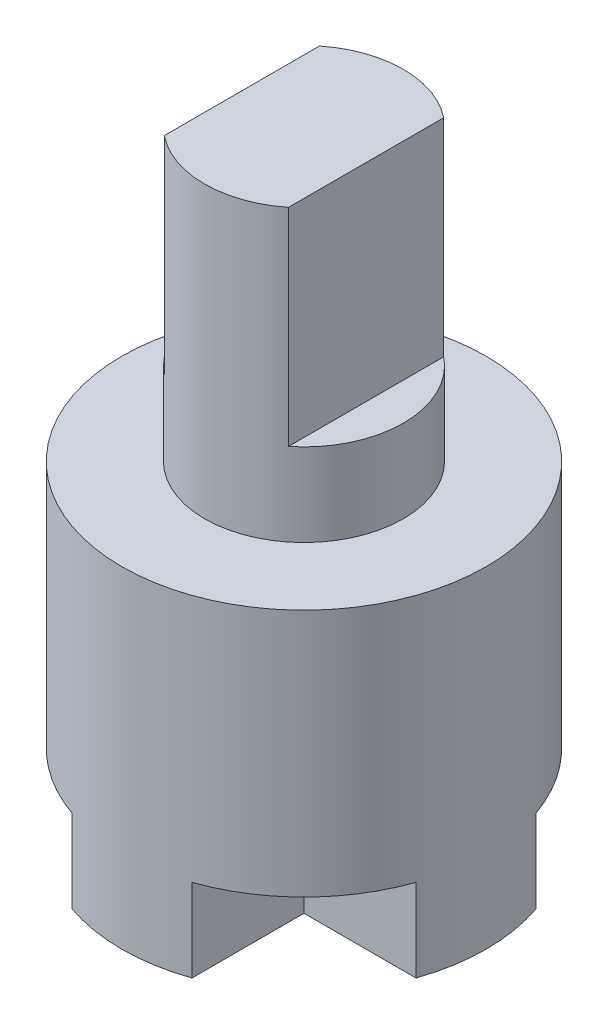
ISO-10303-21;
HEADER;
FILE_DESCRIPTION(('STEP AP214'),'2;1');
FILE_NAME('part.step','',(''),(''),'','','');
FILE_SCHEMA(('AUTOMOTIVE_DESIGN { 1 0 10303 214 1 1 1 1 }'));
ENDSEC;
DATA;
#1=APPLICATION_CONTEXT('core data for automotive mechanical design processes');
#2=APPLICATION_PROTOCOL_DEFINITION('international standard','automotive_design',2000,#1);
#3=PRODUCT_CONTEXT('',#1,'mechanical');
#4=PRODUCT('Part','Part','',(#3));
#5=PRODUCT_RELATED_PRODUCT_CATEGORY('part','',(#4));
#6=PRODUCT_DEFINITION_FORMATION('','',#4);
#7=PRODUCT_DEFINITION_CONTEXT('part definition',#1,'design');
#8=PRODUCT_DEFINITION('design','',#6,#7);
#9=PRODUCT_DEFINITION_SHAPE('','',#8);
#10=(LENGTH_UNIT() NAMED_UNIT(*) SI_UNIT(.MILLI.,.METRE.));
#11=(NAMED_UNIT(*) PLANE_ANGLE_UNIT() SI_UNIT($,.RADIAN.));
#12=(NAMED_UNIT(*) SI_UNIT($,.STERADIAN.) SOLID_ANGLE_UNIT());
#13=UNCERTAINTY_MEASURE_WITH_UNIT(LENGTH_MEASURE(1.E-05),#10,'distance_accuracy_value','');
#14=(GEOMETRIC_REPRESENTATION_CONTEXT(3) GLOBAL_UNCERTAINTY_ASSIGNED_CONTEXT((#13)) GLOBAL_UNIT_ASSIGNED_CONTEXT((#10,
#11,#12)) REPRESENTATION_CONTEXT('',''));
#15=CARTESIAN_POINT('',(0.,0.,0.));
#16=DIRECTION('',(0.,0.,1.));
#17=DIRECTION('',(1.,0.,0.));
#18=AXIS2_PLACEMENT_3D('',#15,#16,#17);
#19=CARTESIAN_POINT('',(0.,0.,0.));
#20=DIRECTION('',(0.,1.,0.));
#21=DIRECTION('',(0.,0.,1.));
#22=AXIS2_PLACEMENT_3D('',#19,#20,#21);
#23=PLANE('',#22);
#24=DIRECTION('',(0.,0.,-1.));
#25=VECTOR('',#24,1.);
#26=CARTESIAN_POINT('',(-1.45,0.,0.));
#27=LINE('',#26,#25);
#28=CARTESIAN_POINT('',(-1.45,0.,-1.45));
#29=VERTEX_POINT('',#28);
#30=CARTESIAN_POINT('',(-1.45,0.,-4.15421472723787));
#31=VERTEX_POINT('',#30);
#32=EDGE_CURVE('E56',#29,#31,#27,.T.);
#33=ORIENTED_EDGE('',*,*,#32,.F.);
#34=DIRECTION('',(1.,0.,0.));
#35=VECTOR('',#34,1.);
#36=CARTESIAN_POINT('',(0.,0.,-1.45));
#37=LINE('',#36,#35);
#38=CARTESIAN_POINT('',(-4.15421472723787,0.,-1.45));
#39=VERTEX_POINT('',#38);
#40=EDGE_CURVE('E180',#39,#29,#37,.T.);
#41=ORIENTED_EDGE('',*,*,#40,.F.);
#42=CARTESIAN_POINT('',(0.,0.,0.));
#43=DIRECTION('',(0.,1.,0.));
#44=DIRECTION('',(0.,0.,1.));
#45=AXIS2_PLACEMENT_3D('',#42,#43,#44);
#46=CIRCLE('',#45,4.4);
#47=EDGE_CURVE('E281',#31,#39,#46,.T.);
#48=ORIENTED_EDGE('',*,*,#47,.F.);
#49=EDGE_LOOP('',(#33,#41,#48));
#50=FACE_BOUND('',#49,.T.);
#51=ADVANCED_FACE('F39',(#50),#23,.F.);
#52=CARTESIAN_POINT('',(-4.15421472723787,0.,1.45));
#53=VERTEX_POINT('',#52);
#54=CARTESIAN_POINT('',(-1.45,0.,4.15421472723787));
#55=VERTEX_POINT('',#54);
#56=EDGE_CURVE('E272',#53,#55,#46,.T.);
#57=ORIENTED_EDGE('',*,*,#56,.F.);
#58=DIRECTION('',(1.,0.,0.));
#59=VECTOR('',#58,1.);
#60=CARTESIAN_POINT('',(0.,0.,1.45));
#61=LINE('',#60,#59);
#62=CARTESIAN_POINT('',(-1.45,0.,1.45));
#63=VERTEX_POINT('',#62);
#64=EDGE_CURVE('E64',#53,#63,#61,.T.);
#65=ORIENTED_EDGE('',*,*,#64,.T.);
#66=DIRECTION('',(0.,0.,-1.));
#67=VECTOR('',#66,1.);
#68=CARTESIAN_POINT('',(-1.45,0.,0.));
#69=LINE('',#68,#67);
#70=EDGE_CURVE('E212',#55,#63,#69,.T.);
#71=ORIENTED_EDGE('',*,*,#70,.F.);
#72=EDGE_LOOP('',(#57,#65,#71));
#73=FACE_BOUND('',#72,.T.);
#74=ADVANCED_FACE('F300',(#73),#23,.F.);
#75=CARTESIAN_POINT('',(1.45,0.,4.15421472723787));
#76=VERTEX_POINT('',#75);
#77=CARTESIAN_POINT('',(4.15421472723787,0.,1.45));
#78=VERTEX_POINT('',#77);
#79=EDGE_CURVE('E43',#76,#78,#46,.T.);
#80=ORIENTED_EDGE('',*,*,#79,.F.);
#81=DIRECTION('',(0.,0.,-1.));
#82=VECTOR('',#81,1.);
#83=CARTESIAN_POINT('',(1.45,0.,0.));
#84=LINE('',#83,#82);
#85=CARTESIAN_POINT('',(1.45,0.,1.45));
#86=VERTEX_POINT('',#85);
#87=EDGE_CURVE('E210',#76,#86,#84,.T.);
#88=ORIENTED_EDGE('',*,*,#87,.T.);
#89=DIRECTION('',(1.,0.,0.));
#90=VECTOR('',#89,1.);
#91=CARTESIAN_POINT('',(0.,0.,1.45));
#92=LINE('',#91,#90);
#93=EDGE_CURVE('E208',#86,#78,#92,.T.);
#94=ORIENTED_EDGE('',*,*,#93,.T.);
#95=EDGE_LOOP('',(#80,#88,#94));
#96=FACE_BOUND('',#95,.T.);
#97=ADVANCED_FACE('F302',(#96),#23,.F.);
#98=CARTESIAN_POINT('',(0.,8.,0.));
#99=DIRECTION('',(0.,1.,0.));
#100=DIRECTION('',(0.,0.,1.));
#101=AXIS2_PLACEMENT_3D('',#98,#99,#100);
#102=PLANE('',#101);
#103=CARTESIAN_POINT('',(0.,8.,0.));
#104=DIRECTION('',(0.,1.,0.));
#105=DIRECTION('',(0.,0.,1.));
#106=AXIS2_PLACEMENT_3D('',#103,#104,#105);
#107=CIRCLE('',#106,2.4);
#108=CARTESIAN_POINT('',(-1.5,8.,-1.87349939951952));
#109=VERTEX_POINT('',#108);
#110=CARTESIAN_POINT('',(-1.5,8.,1.87349939951952));
#111=VERTEX_POINT('',#110);
#112=EDGE_CURVE('E270',#109,#111,#107,.T.);
#113=ORIENTED_EDGE('',*,*,#112,.T.);
#114=DIRECTION('',(0.,0.,-1.));
#115=VECTOR('',#114,1.);
#116=CARTESIAN_POINT('',(-1.5,8.,0.));
#117=LINE('',#116,#115);
#118=EDGE_CURVE('E249',#111,#109,#117,.T.);
#119=ORIENTED_EDGE('',*,*,#118,.T.);
#120=EDGE_LOOP('',(#113,#119));
#121=FACE_BOUND('',#120,.T.);
#122=ADVANCED_FACE('F307',(#121),#102,.T.);
#123=CARTESIAN_POINT('',(0.,6.,0.));
#124=DIRECTION('',(0.,-1.,0.));
#125=DIRECTION('',(0.,0.,-1.));
#126=AXIS2_PLACEMENT_3D('',#123,#124,#125);
#127=CYLINDRICAL_SURFACE('',#126,4.4);
#128=CARTESIAN_POINT('',(0.,6.,0.));
#129=DIRECTION('',(0.,1.,0.));
#130=DIRECTION('',(0.,0.,1.));
#131=AXIS2_PLACEMENT_3D('',#128,#129,#130);
#132=CIRCLE('',#131,4.4);
#133=CARTESIAN_POINT('',(0.,6.,4.4));
#134=VERTEX_POINT('',#133);
#135=EDGE_CURVE('E48',#134,#134,#132,.T.);
#136=ORIENTED_EDGE('',*,*,#135,.F.);
#137=EDGE_LOOP('',(#136));
#138=FACE_BOUND('',#137,.T.);
#139=ORIENTED_EDGE('',*,*,#79,.T.);
#140=DIRECTION('',(0.,1.,0.));
#141=VECTOR('',#140,1.);
#142=CARTESIAN_POINT('',(4.15421472723787,-2.,1.45));
#143=LINE('',#142,#141);
#144=CARTESIAN_POINT('',(4.15421472723787,-2.,1.45));
#145=VERTEX_POINT('',#144);
#146=EDGE_CURVE('E241',#145,#78,#143,.T.);
#147=ORIENTED_EDGE('',*,*,#146,.F.);
#148=CARTESIAN_POINT('',(0.,-2.,0.));
#149=DIRECTION('',(0.,-1.,0.));
#150=DIRECTION('',(0.,0.,-1.));
#151=AXIS2_PLACEMENT_3D('',#148,#149,#150);
#152=CIRCLE('',#151,4.4);
#153=CARTESIAN_POINT('',(4.15421472723787,-2.,-1.45));
#154=VERTEX_POINT('',#153);
#155=EDGE_CURVE('E173',#154,#145,#152,.T.);
#156=ORIENTED_EDGE('',*,*,#155,.F.);
#157=DIRECTION('',(0.,1.,0.));
#158=VECTOR('',#157,1.);
#159=CARTESIAN_POINT('',(4.15421472723787,-2.,-1.45));
#160=LINE('',#159,#158);
#161=CARTESIAN_POINT('',(4.15421472723787,0.,-1.45));
#162=VERTEX_POINT('',#161);
#163=EDGE_CURVE('E165',#154,#162,#160,.T.);
#164=ORIENTED_EDGE('',*,*,#163,.T.);
#165=CARTESIAN_POINT('',(1.45,0.,-4.15421472723787));
#166=VERTEX_POINT('',#165);
#167=EDGE_CURVE('E277',#162,#166,#46,.T.);
#168=ORIENTED_EDGE('',*,*,#167,.T.);
#169=DIRECTION('',(0.,1.,0.));
#170=VECTOR('',#169,1.);
#171=CARTESIAN_POINT('',(1.45,-2.,-4.15421472723787));
#172=LINE('',#171,#170);
#173=CARTESIAN_POINT('',(1.45,-2.,-4.15421472723787));
#174=VERTEX_POINT('',#173);
#175=EDGE_CURVE('E204',#174,#166,#172,.T.);
#176=ORIENTED_EDGE('',*,*,#175,.F.);
#177=CARTESIAN_POINT('',(0.,-2.,0.));
#178=DIRECTION('',(0.,-1.,0.));
#179=DIRECTION('',(0.,0.,-1.));
#180=AXIS2_PLACEMENT_3D('',#177,#178,#179);
#181=CIRCLE('',#180,4.4);
#182=CARTESIAN_POINT('',(-1.45,-2.,-4.15421472723787));
#183=VERTEX_POINT('',#182);
#184=EDGE_CURVE('E177',#183,#174,#181,.T.);
#185=ORIENTED_EDGE('',*,*,#184,.F.);
#186=DIRECTION('',(0.,1.,0.));
#187=VECTOR('',#186,1.);
#188=CARTESIAN_POINT('',(-1.45,-2.,-4.15421472723787));
#189=LINE('',#188,#187);
#190=EDGE_CURVE('E218',#183,#31,#189,.T.);
#191=ORIENTED_EDGE('',*,*,#190,.T.);
#192=ORIENTED_EDGE('',*,*,#47,.T.);
#193=DIRECTION('',(0.,1.,0.));
#194=VECTOR('',#193,1.);
#195=CARTESIAN_POINT('',(-4.15421472723787,-2.,-1.45));
#196=LINE('',#195,#194);
#197=CARTESIAN_POINT('',(-4.15421472723787,-2.,-1.45));
#198=VERTEX_POINT('',#197);
#199=EDGE_CURVE('E224',#198,#39,#196,.T.);
#200=ORIENTED_EDGE('',*,*,#199,.F.);
#201=CARTESIAN_POINT('',(0.,-2.,0.));
#202=DIRECTION('',(0.,-1.,0.));
#203=DIRECTION('',(0.,0.,-1.));
#204=AXIS2_PLACEMENT_3D('',#201,#202,#203);
#205=CIRCLE('',#204,4.4);
#206=CARTESIAN_POINT('',(-4.15421472723787,-2.,1.45));
#207=VERTEX_POINT('',#206);
#208=EDGE_CURVE('E197',#207,#198,#205,.T.);
#209=ORIENTED_EDGE('',*,*,#208,.F.);
#210=DIRECTION('',(0.,1.,0.));
#211=VECTOR('',#210,1.);
#212=CARTESIAN_POINT('',(-4.15421472723787,-2.,1.45));
#213=LINE('',#212,#211);
#214=EDGE_CURVE('E227',#207,#53,#213,.T.);
#215=ORIENTED_EDGE('',*,*,#214,.T.);
#216=ORIENTED_EDGE('',*,*,#56,.T.);
#217=DIRECTION('',(0.,1.,0.));
#218=VECTOR('',#217,1.);
#219=CARTESIAN_POINT('',(-1.45,-2.,4.15421472723787));
#220=LINE('',#219,#218);
#221=CARTESIAN_POINT('',(-1.45,-2.,4.15421472723787));
#222=VERTEX_POINT('',#221);
#223=EDGE_CURVE('E232',#222,#55,#220,.T.);
#224=ORIENTED_EDGE('',*,*,#223,.F.);
#225=CARTESIAN_POINT('',(0.,-2.,0.));
#226=DIRECTION('',(0.,-1.,0.));
#227=DIRECTION('',(0.,0.,-1.));
#228=AXIS2_PLACEMENT_3D('',#225,#226,#227);
#229=CIRCLE('',#228,4.4);
#230=CARTESIAN_POINT('',(1.45,-2.,4.15421472723787));
#231=VERTEX_POINT('',#230);
#232=EDGE_CURVE('E190',#231,#222,#229,.T.);
#233=ORIENTED_EDGE('',*,*,#232,.F.);
#234=DIRECTION('',(0.,1.,0.));
#235=VECTOR('',#234,1.);
#236=CARTESIAN_POINT('',(1.45,-2.,4.15421472723787));
#237=LINE('',#236,#235);
#238=EDGE_CURVE('E235',#231,#76,#237,.T.);
#239=ORIENTED_EDGE('',*,*,#238,.T.);
#240=EDGE_LOOP('',(#139,#147,#156,#164,#168,#176,#185,#191,#192,#200,#209,#215,#216,#224,#233,#239));
#241=FACE_BOUND('',#240,.T.);
#242=ADVANCED_FACE('F41',(#138,#241),#127,.T.);
#243=CARTESIAN_POINT('',(0.,6.,0.));
#244=DIRECTION('',(0.,1.,0.));
#245=DIRECTION('',(0.,0.,1.));
#246=AXIS2_PLACEMENT_3D('',#243,#244,#245);
#247=PLANE('',#246);
#248=CARTESIAN_POINT('',(0.,6.,0.));
#249=DIRECTION('',(0.,1.,0.));
#250=DIRECTION('',(0.,0.,1.));
#251=AXIS2_PLACEMENT_3D('',#248,#249,#250);
#252=CIRCLE('',#251,2.4);
#253=CARTESIAN_POINT('',(0.,6.,2.4));
#254=VERTEX_POINT('',#253);
#255=EDGE_CURVE('E11',#254,#254,#252,.T.);
#256=ORIENTED_EDGE('',*,*,#255,.F.);
#257=EDGE_LOOP('',(#256));
#258=FACE_BOUND('',#257,.T.);
#259=ORIENTED_EDGE('',*,*,#135,.T.);
#260=EDGE_LOOP('',(#259));
#261=FACE_BOUND('',#260,.T.);
#262=ADVANCED_FACE('F313',(#258,#261),#247,.T.);
#263=DIRECTION('',(1.,0.,0.));
#264=VECTOR('',#263,1.);
#265=CARTESIAN_POINT('',(0.,0.,-1.45));
#266=LINE('',#265,#264);
#267=CARTESIAN_POINT('',(1.45,0.,-1.45));
#268=VERTEX_POINT('',#267);
#269=EDGE_CURVE('E206',#268,#162,#266,.T.);
#270=ORIENTED_EDGE('',*,*,#269,.F.);
#271=DIRECTION('',(0.,0.,-1.));
#272=VECTOR('',#271,1.);
#273=CARTESIAN_POINT('',(1.45,0.,0.));
#274=LINE('',#273,#272);
#275=EDGE_CURVE('E161',#268,#166,#274,.T.);
#276=ORIENTED_EDGE('',*,*,#275,.T.);
#277=ORIENTED_EDGE('',*,*,#167,.F.);
#278=EDGE_LOOP('',(#270,#276,#277));
#279=FACE_BOUND('',#278,.T.);
#280=ADVANCED_FACE('F309',(#279),#23,.F.);
#281=CARTESIAN_POINT('',(0.,8.,0.));
#282=DIRECTION('',(0.,-1.,0.));
#283=DIRECTION('',(0.,0.,-1.));
#284=AXIS2_PLACEMENT_3D('',#281,#282,#283);
#285=CYLINDRICAL_SURFACE('',#284,2.4);
#286=CARTESIAN_POINT('',(1.5,8.,1.87349939951952));
#287=VERTEX_POINT('',#286);
#288=CARTESIAN_POINT('',(1.5,8.,-1.87349939951952));
#289=VERTEX_POINT('',#288);
#290=EDGE_CURVE('E271',#287,#289,#107,.T.);
#291=ORIENTED_EDGE('',*,*,#290,.F.);
#292=DIRECTION('',(0.,-1.,0.));
#293=VECTOR('',#292,1.);
#294=CARTESIAN_POINT('',(1.5,13.,1.87349939951952));
#295=LINE('',#294,#293);
#296=CARTESIAN_POINT('',(1.5,13.,1.87349939951952));
#297=VERTEX_POINT('',#296);
#298=EDGE_CURVE('E267',#297,#287,#295,.T.);
#299=ORIENTED_EDGE('',*,*,#298,.F.);
#300=CARTESIAN_POINT('',(0.,13.,0.));
#301=DIRECTION('',(0.,1.,0.));
#302=DIRECTION('',(0.,0.,1.));
#303=AXIS2_PLACEMENT_3D('',#300,#301,#302);
#304=CIRCLE('',#303,2.4);
#305=CARTESIAN_POINT('',(-1.5,13.,1.87349939951952));
#306=VERTEX_POINT('',#305);
#307=EDGE_CURVE('E245',#306,#297,#304,.T.);
#308=ORIENTED_EDGE('',*,*,#307,.F.);
#309=DIRECTION('',(0.,-1.,0.));
#310=VECTOR('',#309,1.);
#311=CARTESIAN_POINT('',(-1.5,13.,1.87349939951952));
#312=LINE('',#311,#310);
#313=EDGE_CURVE('E255',#306,#111,#312,.T.);
#314=ORIENTED_EDGE('',*,*,#313,.T.);
#315=ORIENTED_EDGE('',*,*,#112,.F.);
#316=DIRECTION('',(0.,-1.,0.));
#317=VECTOR('',#316,1.);
#318=CARTESIAN_POINT('',(-1.5,13.,-1.87349939951952));
#319=LINE('',#318,#317);
#320=CARTESIAN_POINT('',(-1.5,13.,-1.87349939951952));
#321=VERTEX_POINT('',#320);
#322=EDGE_CURVE('E261',#321,#109,#319,.T.);
#323=ORIENTED_EDGE('',*,*,#322,.F.);
#324=CARTESIAN_POINT('',(1.5,13.,-1.87349939951952));
#325=VERTEX_POINT('',#324);
#326=EDGE_CURVE('E250',#325,#321,#304,.T.);
#327=ORIENTED_EDGE('',*,*,#326,.F.);
#328=DIRECTION('',(0.,-1.,0.));
#329=VECTOR('',#328,1.);
#330=CARTESIAN_POINT('',(1.5,13.,-1.87349939951952));
#331=LINE('',#330,#329);
#332=EDGE_CURVE('E264',#325,#289,#331,.T.);
#333=ORIENTED_EDGE('',*,*,#332,.T.);
#334=EDGE_LOOP('',(#291,#299,#308,#314,#315,#323,#327,#333));
#335=FACE_BOUND('',#334,.T.);
#336=ORIENTED_EDGE('',*,*,#255,.T.);
#337=EDGE_LOOP('',(#336));
#338=FACE_BOUND('',#337,.T.);
#339=ADVANCED_FACE('F312',(#335,#338),#285,.T.);
#340=DIRECTION('',(0.,0.,-1.));
#341=VECTOR('',#340,1.);
#342=CARTESIAN_POINT('',(1.5,8.,0.));
#343=LINE('',#342,#341);
#344=EDGE_CURVE('E164',#287,#289,#343,.T.);
#345=ORIENTED_EDGE('',*,*,#344,.F.);
#346=ORIENTED_EDGE('',*,*,#290,.T.);
#347=EDGE_LOOP('',(#345,#346));
#348=FACE_BOUND('',#347,.T.);
#349=ADVANCED_FACE('F320',(#348),#102,.T.);
#350=CARTESIAN_POINT('',(1.5,13.,0.));
#351=DIRECTION('',(-1.,0.,0.));
#352=DIRECTION('',(0.,0.,1.));
#353=AXIS2_PLACEMENT_3D('',#350,#351,#352);
#354=PLANE('',#353);
#355=ORIENTED_EDGE('',*,*,#344,.T.);
#356=ORIENTED_EDGE('',*,*,#332,.F.);
#357=DIRECTION('',(0.,0.,-1.));
#358=VECTOR('',#357,1.);
#359=CARTESIAN_POINT('',(1.5,13.,0.));
#360=LINE('',#359,#358);
#361=EDGE_CURVE('E248',#297,#325,#360,.T.);
#362=ORIENTED_EDGE('',*,*,#361,.F.);
#363=ORIENTED_EDGE('',*,*,#298,.T.);
#364=EDGE_LOOP('',(#355,#356,#362,#363));
#365=FACE_BOUND('',#364,.T.);
#366=ADVANCED_FACE('F324',(#365),#354,.F.);
#367=CARTESIAN_POINT('',(-1.5,13.,0.));
#368=DIRECTION('',(-1.,0.,0.));
#369=DIRECTION('',(0.,0.,1.));
#370=AXIS2_PLACEMENT_3D('',#367,#368,#369);
#371=PLANE('',#370);
#372=ORIENTED_EDGE('',*,*,#118,.F.);
#373=ORIENTED_EDGE('',*,*,#313,.F.);
#374=DIRECTION('',(0.,0.,-1.));
#375=VECTOR('',#374,1.);
#376=CARTESIAN_POINT('',(-1.5,13.,0.));
#377=LINE('',#376,#375);
#378=EDGE_CURVE('E252',#306,#321,#377,.T.);
#379=ORIENTED_EDGE('',*,*,#378,.T.);
#380=ORIENTED_EDGE('',*,*,#322,.T.);
#381=EDGE_LOOP('',(#372,#373,#379,#380));
#382=FACE_BOUND('',#381,.T.);
#383=ADVANCED_FACE('F328',(#382),#371,.T.);
#384=CARTESIAN_POINT('',(0.,13.,0.));
#385=DIRECTION('',(0.,1.,0.));
#386=DIRECTION('',(0.,0.,1.));
#387=AXIS2_PLACEMENT_3D('',#384,#385,#386);
#388=PLANE('',#387);
#389=ORIENTED_EDGE('',*,*,#307,.T.);
#390=ORIENTED_EDGE('',*,*,#361,.T.);
#391=ORIENTED_EDGE('',*,*,#326,.T.);
#392=ORIENTED_EDGE('',*,*,#378,.F.);
#393=EDGE_LOOP('',(#389,#390,#391,#392));
#394=FACE_BOUND('',#393,.T.);
#395=ADVANCED_FACE('F332',(#394),#388,.T.);
#396=CARTESIAN_POINT('',(1.45,-2.,0.));
#397=DIRECTION('',(1.,0.,0.));
#398=DIRECTION('',(0.,0.,-1.));
#399=AXIS2_PLACEMENT_3D('',#396,#397,#398);
#400=PLANE('',#399);
#401=ORIENTED_EDGE('',*,*,#275,.F.);
#402=DIRECTION('',(0.,1.,0.));
#403=VECTOR('',#402,1.);
#404=CARTESIAN_POINT('',(1.45,-2.,-1.45));
#405=LINE('',#404,#403);
#406=CARTESIAN_POINT('',(1.45,-2.,-1.45));
#407=VERTEX_POINT('',#406);
#408=EDGE_CURVE('E155',#407,#268,#405,.T.);
#409=ORIENTED_EDGE('',*,*,#408,.F.);
#410=DIRECTION('',(0.,0.,-1.));
#411=VECTOR('',#410,1.);
#412=CARTESIAN_POINT('',(1.45,-2.,0.));
#413=LINE('',#412,#411);
#414=EDGE_CURVE('E160',#407,#174,#413,.T.);
#415=ORIENTED_EDGE('',*,*,#414,.T.);
#416=ORIENTED_EDGE('',*,*,#175,.T.);
#417=EDGE_LOOP('',(#401,#409,#415,#416));
#418=FACE_BOUND('',#417,.T.);
#419=ADVANCED_FACE('F157',(#418),#400,.T.);
#420=CARTESIAN_POINT('',(0.,-2.,-1.45));
#421=DIRECTION('',(0.,0.,1.));
#422=DIRECTION('',(1.,0.,0.));
#423=AXIS2_PLACEMENT_3D('',#420,#421,#422);
#424=PLANE('',#423);
#425=ORIENTED_EDGE('',*,*,#269,.T.);
#426=ORIENTED_EDGE('',*,*,#163,.F.);
#427=DIRECTION('',(1.,0.,0.));
#428=VECTOR('',#427,1.);
#429=CARTESIAN_POINT('',(0.,-2.,-1.45));
#430=LINE('',#429,#428);
#431=EDGE_CURVE('E168',#407,#154,#430,.T.);
#432=ORIENTED_EDGE('',*,*,#431,.F.);
#433=ORIENTED_EDGE('',*,*,#408,.T.);
#434=EDGE_LOOP('',(#425,#426,#432,#433));
#435=FACE_BOUND('',#434,.T.);
#436=ADVANCED_FACE('F169',(#435),#424,.F.);
#437=CARTESIAN_POINT('',(0.,-2.,1.45));
#438=DIRECTION('',(0.,0.,1.));
#439=DIRECTION('',(1.,0.,0.));
#440=AXIS2_PLACEMENT_3D('',#437,#438,#439);
#441=PLANE('',#440);
#442=ORIENTED_EDGE('',*,*,#93,.F.);
#443=DIRECTION('',(0.,1.,0.));
#444=VECTOR('',#443,1.);
#445=CARTESIAN_POINT('',(1.45,-2.,1.45));
#446=LINE('',#445,#444);
#447=CARTESIAN_POINT('',(1.45,-2.,1.45));
#448=VERTEX_POINT('',#447);
#449=EDGE_CURVE('E238',#448,#86,#446,.T.);
#450=ORIENTED_EDGE('',*,*,#449,.F.);
#451=DIRECTION('',(1.,0.,0.));
#452=VECTOR('',#451,1.);
#453=CARTESIAN_POINT('',(0.,-2.,1.45));
#454=LINE('',#453,#452);
#455=EDGE_CURVE('E184',#448,#145,#454,.T.);
#456=ORIENTED_EDGE('',*,*,#455,.T.);
#457=ORIENTED_EDGE('',*,*,#146,.T.);
#458=EDGE_LOOP('',(#442,#450,#456,#457));
#459=FACE_BOUND('',#458,.T.);
#460=ADVANCED_FACE('F341',(#459),#441,.T.);
#461=CARTESIAN_POINT('',(1.45,-2.,0.));
#462=DIRECTION('',(1.,0.,0.));
#463=DIRECTION('',(0.,0.,-1.));
#464=AXIS2_PLACEMENT_3D('',#461,#462,#463);
#465=PLANE('',#464);
#466=ORIENTED_EDGE('',*,*,#87,.F.);
#467=ORIENTED_EDGE('',*,*,#238,.F.);
#468=DIRECTION('',(0.,0.,-1.));
#469=VECTOR('',#468,1.);
#470=CARTESIAN_POINT('',(1.45,-2.,0.));
#471=LINE('',#470,#469);
#472=EDGE_CURVE('E187',#231,#448,#471,.T.);
#473=ORIENTED_EDGE('',*,*,#472,.T.);
#474=ORIENTED_EDGE('',*,*,#449,.T.);
#475=EDGE_LOOP('',(#466,#467,#473,#474));
#476=FACE_BOUND('',#475,.T.);
#477=ADVANCED_FACE('F344',(#476),#465,.T.);
#478=CARTESIAN_POINT('',(-1.45,-2.,0.));
#479=DIRECTION('',(1.,0.,0.));
#480=DIRECTION('',(0.,0.,-1.));
#481=AXIS2_PLACEMENT_3D('',#478,#479,#480);
#482=PLANE('',#481);
#483=ORIENTED_EDGE('',*,*,#70,.T.);
#484=DIRECTION('',(0.,1.,0.));
#485=VECTOR('',#484,1.);
#486=CARTESIAN_POINT('',(-1.45,-2.,1.45));
#487=LINE('',#486,#485);
#488=CARTESIAN_POINT('',(-1.45,-2.,1.45));
#489=VERTEX_POINT('',#488);
#490=EDGE_CURVE('E230',#489,#63,#487,.T.);
#491=ORIENTED_EDGE('',*,*,#490,.F.);
#492=DIRECTION('',(0.,0.,-1.));
#493=VECTOR('',#492,1.);
#494=CARTESIAN_POINT('',(-1.45,-2.,0.));
#495=LINE('',#494,#493);
#496=EDGE_CURVE('E192',#222,#489,#495,.T.);
#497=ORIENTED_EDGE('',*,*,#496,.F.);
#498=ORIENTED_EDGE('',*,*,#223,.T.);
#499=EDGE_LOOP('',(#483,#491,#497,#498));
#500=FACE_BOUND('',#499,.T.);
#501=ADVANCED_FACE('F299',(#500),#482,.F.);
#502=CARTESIAN_POINT('',(0.,-2.,1.45));
#503=DIRECTION('',(0.,0.,1.));
#504=DIRECTION('',(1.,0.,0.));
#505=AXIS2_PLACEMENT_3D('',#502,#503,#504);
#506=PLANE('',#505);
#507=ORIENTED_EDGE('',*,*,#64,.F.);
#508=ORIENTED_EDGE('',*,*,#214,.F.);
#509=DIRECTION('',(1.,0.,0.));
#510=VECTOR('',#509,1.);
#511=CARTESIAN_POINT('',(0.,-2.,1.45));
#512=LINE('',#511,#510);
#513=EDGE_CURVE('E194',#207,#489,#512,.T.);
#514=ORIENTED_EDGE('',*,*,#513,.T.);
#515=ORIENTED_EDGE('',*,*,#490,.T.);
#516=EDGE_LOOP('',(#507,#508,#514,#515));
#517=FACE_BOUND('',#516,.T.);
#518=ADVANCED_FACE('F295',(#517),#506,.T.);
#519=CARTESIAN_POINT('',(0.,-2.,-1.45));
#520=DIRECTION('',(0.,0.,1.));
#521=DIRECTION('',(1.,0.,0.));
#522=AXIS2_PLACEMENT_3D('',#519,#520,#521);
#523=PLANE('',#522);
#524=ORIENTED_EDGE('',*,*,#40,.T.);
#525=DIRECTION('',(0.,1.,0.));
#526=VECTOR('',#525,1.);
#527=CARTESIAN_POINT('',(-1.45,-2.,-1.45));
#528=LINE('',#527,#526);
#529=CARTESIAN_POINT('',(-1.45,-2.,-1.45));
#530=VERTEX_POINT('',#529);
#531=EDGE_CURVE('E221',#530,#29,#528,.T.);
#532=ORIENTED_EDGE('',*,*,#531,.F.);
#533=DIRECTION('',(1.,0.,0.));
#534=VECTOR('',#533,1.);
#535=CARTESIAN_POINT('',(0.,-2.,-1.45));
#536=LINE('',#535,#534);
#537=EDGE_CURVE('E199',#198,#530,#536,.T.);
#538=ORIENTED_EDGE('',*,*,#537,.F.);
#539=ORIENTED_EDGE('',*,*,#199,.T.);
#540=EDGE_LOOP('',(#524,#532,#538,#539));
#541=FACE_BOUND('',#540,.T.);
#542=ADVANCED_FACE('F290',(#541),#523,.F.);
#543=CARTESIAN_POINT('',(-1.45,-2.,0.));
#544=DIRECTION('',(1.,0.,0.));
#545=DIRECTION('',(0.,0.,-1.));
#546=AXIS2_PLACEMENT_3D('',#543,#544,#545);
#547=PLANE('',#546);
#548=ORIENTED_EDGE('',*,*,#32,.T.);
#549=ORIENTED_EDGE('',*,*,#190,.F.);
#550=DIRECTION('',(0.,0.,-1.));
#551=VECTOR('',#550,1.);
#552=CARTESIAN_POINT('',(-1.45,-2.,0.));
#553=LINE('',#552,#551);
#554=EDGE_CURVE('E201',#530,#183,#553,.T.);
#555=ORIENTED_EDGE('',*,*,#554,.F.);
#556=ORIENTED_EDGE('',*,*,#531,.T.);
#557=EDGE_LOOP('',(#548,#549,#555,#556));
#558=FACE_BOUND('',#557,.T.);
#559=ADVANCED_FACE('F355',(#558),#547,.F.);
#560=CARTESIAN_POINT('',(0.,-2.,0.));
#561=DIRECTION('',(0.,-1.,0.));
#562=DIRECTION('',(0.,0.,-1.));
#563=AXIS2_PLACEMENT_3D('',#560,#561,#562);
#564=PLANE('',#563);
#565=ORIENTED_EDGE('',*,*,#414,.F.);
#566=ORIENTED_EDGE('',*,*,#431,.T.);
#567=ORIENTED_EDGE('',*,*,#155,.T.);
#568=ORIENTED_EDGE('',*,*,#455,.F.);
#569=ORIENTED_EDGE('',*,*,#472,.F.);
#570=ORIENTED_EDGE('',*,*,#232,.T.);
#571=ORIENTED_EDGE('',*,*,#496,.T.);
#572=ORIENTED_EDGE('',*,*,#513,.F.);
#573=ORIENTED_EDGE('',*,*,#208,.T.);
#574=ORIENTED_EDGE('',*,*,#537,.T.);
#575=ORIENTED_EDGE('',*,*,#554,.T.);
#576=ORIENTED_EDGE('',*,*,#184,.T.);
#577=EDGE_LOOP('',(#565,#566,#567,#568,#569,#570,#571,#572,#573,#574,#575,#576));
#578=FACE_BOUND('',#577,.T.);
#579=ADVANCED_FACE('F175',(#578),#564,.T.);
#580=CLOSED_SHELL('',(#51,#74,#97,#122,#242,#262,#280,#339,#349,#366,#383,#395,#419,#436,#460,
#477,#501,#518,#542,#559,#579));
#581=MANIFOLD_SOLID_BREP('B2',#580);
#582=ADVANCED_BREP_SHAPE_REPRESENTATION('',(#18,#581),#14);
#583=SHAPE_DEFINITION_REPRESENTATION(#9,#582);
ENDSEC;
END-ISO-10303-21;
